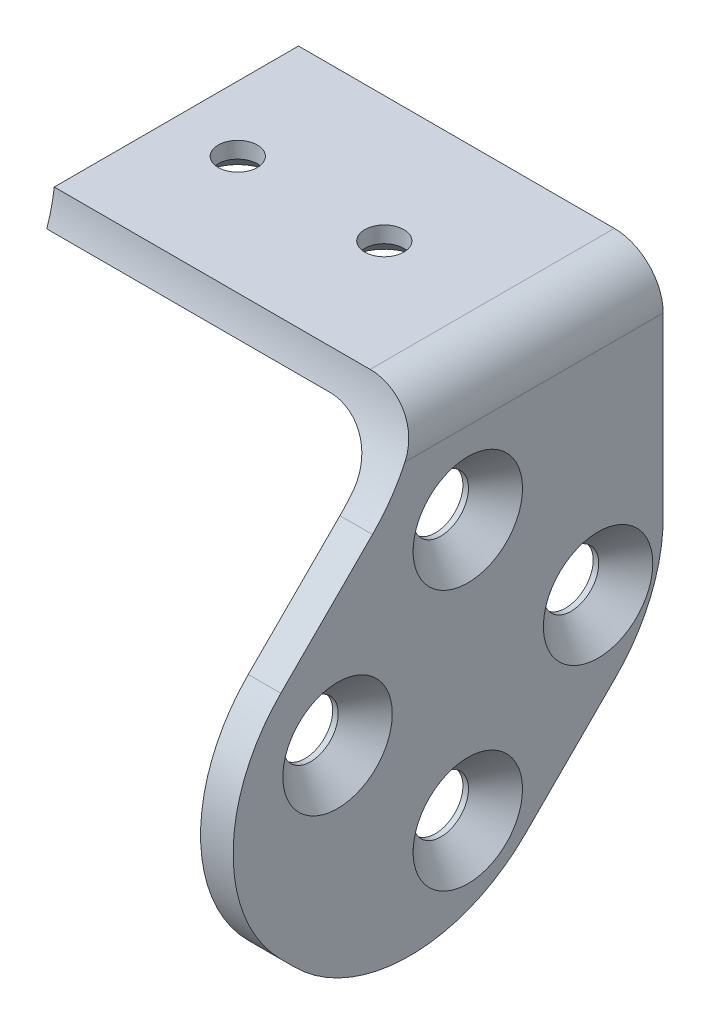
ISO-10303-21;
HEADER;
FILE_DESCRIPTION(('STEP AP214'),'2;1');
FILE_NAME('part.step','',(''),(''),'','','');
FILE_SCHEMA(('AUTOMOTIVE_DESIGN { 1 0 10303 214 1 1 1 1 }'));
ENDSEC;
DATA;
#1=APPLICATION_CONTEXT('core data for automotive mechanical design processes');
#2=APPLICATION_PROTOCOL_DEFINITION('international standard','automotive_design',2000,#1);
#3=PRODUCT_CONTEXT('',#1,'mechanical');
#4=PRODUCT('Part','Part','',(#3));
#5=PRODUCT_RELATED_PRODUCT_CATEGORY('part','',(#4));
#6=PRODUCT_DEFINITION_FORMATION('','',#4);
#7=PRODUCT_DEFINITION_CONTEXT('part definition',#1,'design');
#8=PRODUCT_DEFINITION('design','',#6,#7);
#9=PRODUCT_DEFINITION_SHAPE('','',#8);
#10=(LENGTH_UNIT() NAMED_UNIT(*) SI_UNIT(.MILLI.,.METRE.));
#11=(NAMED_UNIT(*) PLANE_ANGLE_UNIT() SI_UNIT($,.RADIAN.));
#12=(NAMED_UNIT(*) SI_UNIT($,.STERADIAN.) SOLID_ANGLE_UNIT());
#13=UNCERTAINTY_MEASURE_WITH_UNIT(LENGTH_MEASURE(1.E-05),#10,'distance_accuracy_value','');
#14=(GEOMETRIC_REPRESENTATION_CONTEXT(3) GLOBAL_UNCERTAINTY_ASSIGNED_CONTEXT((#13)) GLOBAL_UNIT_ASSIGNED_CONTEXT((#10,
#11,#12)) REPRESENTATION_CONTEXT('',''));
#15=CARTESIAN_POINT('',(0.,0.,0.));
#16=DIRECTION('',(0.,0.,1.));
#17=DIRECTION('',(1.,0.,0.));
#18=AXIS2_PLACEMENT_3D('',#15,#16,#17);
#19=CARTESIAN_POINT('',(0.,2.,0.));
#20=DIRECTION('',(1.,0.,0.));
#21=DIRECTION('',(0.,0.,-1.));
#22=AXIS2_PLACEMENT_3D('',#19,#20,#21);
#23=PLANE('',#22);
#24=DIRECTION('',(0.,0.,1.));
#25=VECTOR('',#24,1.);
#26=CARTESIAN_POINT('',(0.,0.,0.));
#27=LINE('',#26,#25);
#28=CARTESIAN_POINT('',(0.,0.,-15.));
#29=VERTEX_POINT('',#28);
#30=CARTESIAN_POINT('',(0.,0.,0.457120723979524));
#31=VERTEX_POINT('',#30);
#32=EDGE_CURVE('E145',#29,#31,#27,.T.);
#33=ORIENTED_EDGE('',*,*,#32,.T.);
#34=CARTESIAN_POINT('',(0.,3.21639176931118,9.92574385441978));
#35=DIRECTION('',(1.,0.,0.));
#36=DIRECTION('',(0.,0.,-1.));
#37=AXIS2_PLACEMENT_3D('',#34,#35,#36);
#38=CIRCLE('',#37,10.);
#39=CARTESIAN_POINT('',(0.,2.,0.));
#40=VERTEX_POINT('',#39);
#41=EDGE_CURVE('E140',#31,#40,#38,.T.);
#42=ORIENTED_EDGE('',*,*,#41,.T.);
#43=DIRECTION('',(0.,0.,1.));
#44=VECTOR('',#43,1.);
#45=CARTESIAN_POINT('',(0.,2.,0.));
#46=LINE('',#45,#44);
#47=CARTESIAN_POINT('',(0.,2.,-15.));
#48=VERTEX_POINT('',#47);
#49=EDGE_CURVE('E143',#48,#40,#46,.T.);
#50=ORIENTED_EDGE('',*,*,#49,.F.);
#51=DIRECTION('',(0.,-1.,0.));
#52=VECTOR('',#51,1.);
#53=CARTESIAN_POINT('',(0.,2.,-15.));
#54=LINE('',#53,#52);
#55=EDGE_CURVE('E166',#48,#29,#54,.T.);
#56=ORIENTED_EDGE('',*,*,#55,.T.);
#57=EDGE_LOOP('',(#33,#42,#50,#56));
#58=FACE_BOUND('',#57,.T.);
#59=ADVANCED_FACE('F39',(#58),#23,.F.);
#60=CARTESIAN_POINT('',(22.4,2.,0.));
#61=DIRECTION('',(-1.,0.,0.));
#62=DIRECTION('',(0.,0.,1.));
#63=AXIS2_PLACEMENT_3D('',#60,#61,#62);
#64=PLANE('',#63);
#65=CARTESIAN_POINT('',(22.4,-6.,-3.));
#66=DIRECTION('',(1.,0.,0.));
#67=DIRECTION('',(0.,0.,-1.));
#68=AXIS2_PLACEMENT_3D('',#65,#66,#67);
#69=CIRCLE('',#68,3.36);
#70=CARTESIAN_POINT('',(22.4,-6.,-6.36));
#71=VERTEX_POINT('',#70);
#72=EDGE_CURVE('E375',#71,#71,#69,.T.);
#73=ORIENTED_EDGE('',*,*,#72,.F.);
#74=EDGE_LOOP('',(#73));
#75=FACE_BOUND('',#74,.T.);
#76=CARTESIAN_POINT('',(22.4,-14.,-11.));
#77=DIRECTION('',(1.,0.,0.));
#78=DIRECTION('',(0.,0.,-1.));
#79=AXIS2_PLACEMENT_3D('',#76,#77,#78);
#80=CIRCLE('',#79,3.36);
#81=CARTESIAN_POINT('',(22.4,-14.,-14.36));
#82=VERTEX_POINT('',#81);
#83=EDGE_CURVE('E230',#82,#82,#80,.T.);
#84=ORIENTED_EDGE('',*,*,#83,.F.);
#85=EDGE_LOOP('',(#84));
#86=FACE_BOUND('',#85,.T.);
#87=CARTESIAN_POINT('',(22.4,-22.,-3.));
#88=DIRECTION('',(1.,0.,0.));
#89=DIRECTION('',(0.,0.,-1.));
#90=AXIS2_PLACEMENT_3D('',#87,#88,#89);
#91=CIRCLE('',#90,3.36);
#92=CARTESIAN_POINT('',(22.4,-22.,-6.36));
#93=VERTEX_POINT('',#92);
#94=EDGE_CURVE('E225',#93,#93,#91,.T.);
#95=ORIENTED_EDGE('',*,*,#94,.F.);
#96=EDGE_LOOP('',(#95));
#97=FACE_BOUND('',#96,.T.);
#98=CARTESIAN_POINT('',(22.4,-14.,5.));
#99=DIRECTION('',(1.,0.,0.));
#100=DIRECTION('',(0.,0.,-1.));
#101=AXIS2_PLACEMENT_3D('',#98,#99,#100);
#102=CIRCLE('',#101,3.36);
#103=CARTESIAN_POINT('',(22.4,-14.,1.64));
#104=VERTEX_POINT('',#103);
#105=EDGE_CURVE('E220',#104,#104,#102,.T.);
#106=ORIENTED_EDGE('',*,*,#105,.F.);
#107=EDGE_LOOP('',(#106));
#108=FACE_BOUND('',#107,.T.);
#109=DIRECTION('',(0.,-1.,0.));
#110=VECTOR('',#109,1.);
#111=CARTESIAN_POINT('',(22.4,2.,-15.));
#112=LINE('',#111,#110);
#113=CARTESIAN_POINT('',(22.4,-1.,-15.));
#114=VERTEX_POINT('',#113);
#115=CARTESIAN_POINT('',(22.4,-11.8578643762691,-15.));
#116=VERTEX_POINT('',#115);
#117=EDGE_CURVE('E174',#114,#116,#112,.T.);
#118=ORIENTED_EDGE('',*,*,#117,.F.);
#119=DIRECTION('',(0.,0.,-1.));
#120=VECTOR('',#119,1.);
#121=CARTESIAN_POINT('',(22.4,-1.,0.));
#122=LINE('',#121,#120);
#123=CARTESIAN_POINT('',(22.4,-1.,0.858106871849021));
#124=VERTEX_POINT('',#123);
#125=EDGE_CURVE('E235',#114,#124,#122,.F.);
#126=ORIENTED_EDGE('',*,*,#125,.T.);
#127=CARTESIAN_POINT('',(22.4,3.21639176931118,9.92574385441978));
#128=DIRECTION('',(-1.,0.,0.));
#129=DIRECTION('',(0.,0.,1.));
#130=AXIS2_PLACEMENT_3D('',#127,#128,#129);
#131=CIRCLE('',#130,10.);
#132=CARTESIAN_POINT('',(22.4,-3.8546760425543,2.85467604255431));
#133=VERTEX_POINT('',#132);
#134=EDGE_CURVE('E147',#124,#133,#131,.T.);
#135=ORIENTED_EDGE('',*,*,#134,.T.);
#136=DIRECTION('',(0.,0.707106781186546,-0.707106781186549));
#137=VECTOR('',#136,1.);
#138=CARTESIAN_POINT('',(22.4,-16.556349186104,15.5563491861041));
#139=LINE('',#138,#137);
#140=CARTESIAN_POINT('',(22.4,-9.48528137423855,8.48528137423858));
#141=VERTEX_POINT('',#140);
#142=EDGE_CURVE('E400',#141,#133,#139,.T.);
#143=ORIENTED_EDGE('',*,*,#142,.F.);
#144=CARTESIAN_POINT('',(22.4,-16.556349186104,1.41421356237312));
#145=DIRECTION('',(-1.,0.,0.));
#146=DIRECTION('',(0.,0.,1.));
#147=AXIS2_PLACEMENT_3D('',#144,#145,#146);
#148=CIRCLE('',#147,10.);
#149=CARTESIAN_POINT('',(22.4,-23.6274169979695,8.48528137423861));
#150=VERTEX_POINT('',#149);
#151=EDGE_CURVE('E198',#141,#150,#148,.F.);
#152=ORIENTED_EDGE('',*,*,#151,.T.);
#153=DIRECTION('',(0.,0.707106781186549,0.707106781186546));
#154=VECTOR('',#153,1.);
#155=CARTESIAN_POINT('',(22.4,-16.556349186104,15.5563491861041));
#156=LINE('',#155,#154);
#157=CARTESIAN_POINT('',(22.4,-24.4852813742386,7.62741699796954));
#158=VERTEX_POINT('',#157);
#159=EDGE_CURVE('E394',#158,#150,#156,.T.);
#160=ORIENTED_EDGE('',*,*,#159,.F.);
#161=CARTESIAN_POINT('',(22.4,-17.4142135623731,0.55634918610405));
#162=DIRECTION('',(-1.,0.,0.));
#163=DIRECTION('',(0.,0.,1.));
#164=AXIS2_PLACEMENT_3D('',#161,#162,#163);
#165=CIRCLE('',#164,10.);
#166=CARTESIAN_POINT('',(22.4,-24.4852813742386,-6.51471862576141));
#167=VERTEX_POINT('',#166);
#168=EDGE_CURVE('E196',#158,#167,#165,.F.);
#169=ORIENTED_EDGE('',*,*,#168,.T.);
#170=DIRECTION('',(0.,0.707106781186546,-0.707106781186549));
#171=VECTOR('',#170,1.);
#172=CARTESIAN_POINT('',(22.4,-31.5563491861041,0.556349186104078));
#173=LINE('',#172,#171);
#174=CARTESIAN_POINT('',(22.4,-18.9289321881346,-12.0710678118655));
#175=VERTEX_POINT('',#174);
#176=EDGE_CURVE('E403',#167,#175,#173,.T.);
#177=ORIENTED_EDGE('',*,*,#176,.T.);
#178=CARTESIAN_POINT('',(22.4,-11.8578643762691,-5.));
#179=DIRECTION('',(-1.,0.,0.));
#180=DIRECTION('',(0.,0.,1.));
#181=AXIS2_PLACEMENT_3D('',#178,#179,#180);
#182=CIRCLE('',#181,10.);
#183=EDGE_CURVE('E193',#175,#116,#182,.F.);
#184=ORIENTED_EDGE('',*,*,#183,.T.);
#185=EDGE_LOOP('',(#118,#126,#135,#143,#152,#160,#169,#177,#184));
#186=FACE_BOUND('',#185,.T.);
#187=ADVANCED_FACE('F273',(#75,#86,#97,#108,#186),#64,.F.);
#188=CARTESIAN_POINT('',(0.,2.,-15.));
#189=DIRECTION('',(0.,0.,1.));
#190=DIRECTION('',(1.,0.,0.));
#191=AXIS2_PLACEMENT_3D('',#188,#189,#190);
#192=PLANE('',#191);
#193=DIRECTION('',(-1.,0.,0.));
#194=VECTOR('',#193,1.);
#195=CARTESIAN_POINT('',(0.,2.,-15.));
#196=LINE('',#195,#194);
#197=CARTESIAN_POINT('',(19.4,2.,-15.));
#198=VERTEX_POINT('',#197);
#199=EDGE_CURVE('E157',#198,#48,#196,.T.);
#200=ORIENTED_EDGE('',*,*,#199,.F.);
#201=CARTESIAN_POINT('',(19.4,-1.,-15.));
#202=DIRECTION('',(0.,0.,1.));
#203=DIRECTION('',(1.,0.,0.));
#204=AXIS2_PLACEMENT_3D('',#201,#202,#203);
#205=CIRCLE('',#204,3.);
#206=EDGE_CURVE('E233',#198,#114,#205,.F.);
#207=ORIENTED_EDGE('',*,*,#206,.T.);
#208=ORIENTED_EDGE('',*,*,#117,.T.);
#209=DIRECTION('',(1.,0.,0.));
#210=VECTOR('',#209,1.);
#211=CARTESIAN_POINT('',(0.,-11.8578643762691,-15.));
#212=LINE('',#211,#210);
#213=CARTESIAN_POINT('',(20.4,-11.8578643762691,-15.));
#214=VERTEX_POINT('',#213);
#215=EDGE_CURVE('E205',#116,#214,#212,.F.);
#216=ORIENTED_EDGE('',*,*,#215,.T.);
#217=DIRECTION('',(0.,1.,0.));
#218=VECTOR('',#217,1.);
#219=CARTESIAN_POINT('',(20.4,-1.,-15.));
#220=LINE('',#219,#218);
#221=CARTESIAN_POINT('',(20.4,-3.,-15.));
#222=VERTEX_POINT('',#221);
#223=EDGE_CURVE('E171',#214,#222,#220,.T.);
#224=ORIENTED_EDGE('',*,*,#223,.T.);
#225=CARTESIAN_POINT('',(17.4,-3.,-15.));
#226=DIRECTION('',(0.,0.,1.));
#227=DIRECTION('',(1.,0.,0.));
#228=AXIS2_PLACEMENT_3D('',#225,#226,#227);
#229=CIRCLE('',#228,3.);
#230=CARTESIAN_POINT('',(17.4,0.,-15.));
#231=VERTEX_POINT('',#230);
#232=EDGE_CURVE('E53',#222,#231,#229,.T.);
#233=ORIENTED_EDGE('',*,*,#232,.T.);
#234=DIRECTION('',(-1.,0.,0.));
#235=VECTOR('',#234,1.);
#236=CARTESIAN_POINT('',(0.,0.,-15.));
#237=LINE('',#236,#235);
#238=EDGE_CURVE('E159',#231,#29,#237,.T.);
#239=ORIENTED_EDGE('',*,*,#238,.T.);
#240=ORIENTED_EDGE('',*,*,#55,.F.);
#241=EDGE_LOOP('',(#200,#207,#208,#216,#224,#233,#239,#240));
#242=FACE_BOUND('',#241,.T.);
#243=ADVANCED_FACE('F277',(#242),#192,.F.);
#244=CARTESIAN_POINT('',(0.,2.,0.));
#245=DIRECTION('',(0.,-1.,0.));
#246=DIRECTION('',(0.,0.,-1.));
#247=AXIS2_PLACEMENT_3D('',#244,#245,#246);
#248=PLANE('',#247);
#249=CARTESIAN_POINT('',(13.,2.,-7.27143963801024));
#250=DIRECTION('',(0.,-1.,0.));
#251=DIRECTION('',(0.,0.,-1.));
#252=AXIS2_PLACEMENT_3D('',#249,#250,#251);
#253=CIRCLE('',#252,1.2);
#254=CARTESIAN_POINT('',(13.,2.,-8.47143963801024));
#255=VERTEX_POINT('',#254);
#256=EDGE_CURVE('E361',#255,#255,#253,.T.);
#257=ORIENTED_EDGE('',*,*,#256,.T.);
#258=EDGE_LOOP('',(#257));
#259=FACE_BOUND('',#258,.T.);
#260=CARTESIAN_POINT('',(4.,2.,-7.27143963801024));
#261=DIRECTION('',(0.,-1.,0.));
#262=DIRECTION('',(0.,0.,-1.));
#263=AXIS2_PLACEMENT_3D('',#260,#261,#262);
#264=CIRCLE('',#263,1.2);
#265=CARTESIAN_POINT('',(4.,2.,-8.47143963801024));
#266=VERTEX_POINT('',#265);
#267=EDGE_CURVE('E372',#266,#266,#264,.T.);
#268=ORIENTED_EDGE('',*,*,#267,.T.);
#269=EDGE_LOOP('',(#268));
#270=FACE_BOUND('',#269,.T.);
#271=DIRECTION('',(1.,0.,0.));
#272=VECTOR('',#271,1.);
#273=CARTESIAN_POINT('',(0.,2.,0.));
#274=LINE('',#273,#272);
#275=CARTESIAN_POINT('',(19.4,2.,0.));
#276=VERTEX_POINT('',#275);
#277=EDGE_CURVE('E154',#40,#276,#274,.T.);
#278=ORIENTED_EDGE('',*,*,#277,.T.);
#279=DIRECTION('',(0.,0.,-1.));
#280=VECTOR('',#279,1.);
#281=CARTESIAN_POINT('',(19.4,2.,0.));
#282=LINE('',#281,#280);
#283=EDGE_CURVE('E211',#276,#198,#282,.T.);
#284=ORIENTED_EDGE('',*,*,#283,.T.);
#285=ORIENTED_EDGE('',*,*,#199,.T.);
#286=ORIENTED_EDGE('',*,*,#49,.T.);
#287=EDGE_LOOP('',(#278,#284,#285,#286));
#288=FACE_BOUND('',#287,.T.);
#289=ADVANCED_FACE('F152',(#259,#270,#288),#248,.F.);
#290=CARTESIAN_POINT('',(0.,0.,0.));
#291=DIRECTION('',(0.,-1.,0.));
#292=DIRECTION('',(0.,0.,-1.));
#293=AXIS2_PLACEMENT_3D('',#290,#291,#292);
#294=PLANE('',#293);
#295=CARTESIAN_POINT('',(13.,0.,-7.27143963801024));
#296=DIRECTION('',(0.,-1.,0.));
#297=DIRECTION('',(0.,0.,-1.));
#298=AXIS2_PLACEMENT_3D('',#295,#296,#297);
#299=CIRCLE('',#298,2.2);
#300=CARTESIAN_POINT('',(13.,0.,-9.47143963801024));
#301=VERTEX_POINT('',#300);
#302=EDGE_CURVE('E359',#301,#301,#299,.T.);
#303=ORIENTED_EDGE('',*,*,#302,.F.);
#304=EDGE_LOOP('',(#303));
#305=FACE_BOUND('',#304,.T.);
#306=CARTESIAN_POINT('',(4.,0.,-7.27143963801024));
#307=DIRECTION('',(0.,-1.,0.));
#308=DIRECTION('',(0.,0.,-1.));
#309=AXIS2_PLACEMENT_3D('',#306,#307,#308);
#310=CIRCLE('',#309,2.2);
#311=CARTESIAN_POINT('',(4.,0.,-9.47143963801024));
#312=VERTEX_POINT('',#311);
#313=EDGE_CURVE('E366',#312,#312,#310,.T.);
#314=ORIENTED_EDGE('',*,*,#313,.F.);
#315=EDGE_LOOP('',(#314));
#316=FACE_BOUND('',#315,.T.);
#317=ORIENTED_EDGE('',*,*,#238,.F.);
#318=DIRECTION('',(0.,0.,-1.));
#319=VECTOR('',#318,1.);
#320=CARTESIAN_POINT('',(17.4,0.,0.));
#321=LINE('',#320,#319);
#322=CARTESIAN_POINT('',(17.4,0.,0.457120723979524));
#323=VERTEX_POINT('',#322);
#324=EDGE_CURVE('E66',#231,#323,#321,.F.);
#325=ORIENTED_EDGE('',*,*,#324,.T.);
#326=DIRECTION('',(-1.,0.,0.));
#327=VECTOR('',#326,1.);
#328=CARTESIAN_POINT('',(20.4,0.,0.457120723979524));
#329=LINE('',#328,#327);
#330=EDGE_CURVE('E148',#323,#31,#329,.T.);
#331=ORIENTED_EDGE('',*,*,#330,.T.);
#332=ORIENTED_EDGE('',*,*,#32,.F.);
#333=EDGE_LOOP('',(#317,#325,#331,#332));
#334=FACE_BOUND('',#333,.T.);
#335=ADVANCED_FACE('F287',(#305,#316,#334),#294,.T.);
#336=CARTESIAN_POINT('',(20.4,-1.,0.));
#337=DIRECTION('',(1.,0.,0.));
#338=DIRECTION('',(0.,0.,-1.));
#339=AXIS2_PLACEMENT_3D('',#336,#337,#338);
#340=PLANE('',#339);
#341=CARTESIAN_POINT('',(20.4,-6.,-3.));
#342=DIRECTION('',(1.,0.,0.));
#343=DIRECTION('',(0.,0.,-1.));
#344=AXIS2_PLACEMENT_3D('',#341,#342,#343);
#345=CIRCLE('',#344,1.69999999999999);
#346=CARTESIAN_POINT('',(20.4,-6.,-4.69999999999999));
#347=VERTEX_POINT('',#346);
#348=EDGE_CURVE('E227',#347,#347,#345,.T.);
#349=ORIENTED_EDGE('',*,*,#348,.T.);
#350=EDGE_LOOP('',(#349));
#351=FACE_BOUND('',#350,.T.);
#352=CARTESIAN_POINT('',(20.4,-14.,-11.));
#353=DIRECTION('',(1.,0.,0.));
#354=DIRECTION('',(0.,0.,-1.));
#355=AXIS2_PLACEMENT_3D('',#352,#353,#354);
#356=CIRCLE('',#355,1.69999999999999);
#357=CARTESIAN_POINT('',(20.4,-14.,-12.7));
#358=VERTEX_POINT('',#357);
#359=EDGE_CURVE('E222',#358,#358,#356,.T.);
#360=ORIENTED_EDGE('',*,*,#359,.T.);
#361=EDGE_LOOP('',(#360));
#362=FACE_BOUND('',#361,.T.);
#363=CARTESIAN_POINT('',(20.4,-22.,-3.));
#364=DIRECTION('',(1.,0.,0.));
#365=DIRECTION('',(0.,0.,-1.));
#366=AXIS2_PLACEMENT_3D('',#363,#364,#365);
#367=CIRCLE('',#366,1.69999999999999);
#368=CARTESIAN_POINT('',(20.4,-22.,-4.7));
#369=VERTEX_POINT('',#368);
#370=EDGE_CURVE('E217',#369,#369,#367,.T.);
#371=ORIENTED_EDGE('',*,*,#370,.T.);
#372=EDGE_LOOP('',(#371));
#373=FACE_BOUND('',#372,.T.);
#374=CARTESIAN_POINT('',(20.4,-14.,5.));
#375=DIRECTION('',(1.,0.,0.));
#376=DIRECTION('',(0.,0.,-1.));
#377=AXIS2_PLACEMENT_3D('',#374,#375,#376);
#378=CIRCLE('',#377,1.69999999999999);
#379=CARTESIAN_POINT('',(20.4,-14.,3.3));
#380=VERTEX_POINT('',#379);
#381=EDGE_CURVE('E212',#380,#380,#378,.T.);
#382=ORIENTED_EDGE('',*,*,#381,.T.);
#383=EDGE_LOOP('',(#382));
#384=FACE_BOUND('',#383,.T.);
#385=CARTESIAN_POINT('',(20.4,3.21639176931118,9.92574385441978));
#386=DIRECTION('',(1.,0.,0.));
#387=DIRECTION('',(0.,0.,-1.));
#388=AXIS2_PLACEMENT_3D('',#385,#386,#387);
#389=CIRCLE('',#388,10.);
#390=CARTESIAN_POINT('',(20.4,-3.8546760425543,2.85467604255431));
#391=VERTEX_POINT('',#390);
#392=CARTESIAN_POINT('',(20.4,-3.,2.09270655268042));
#393=VERTEX_POINT('',#392);
#394=EDGE_CURVE('E207',#391,#393,#389,.T.);
#395=ORIENTED_EDGE('',*,*,#394,.T.);
#396=DIRECTION('',(0.,0.,-1.));
#397=VECTOR('',#396,1.);
#398=CARTESIAN_POINT('',(20.4,-3.,0.));
#399=LINE('',#398,#397);
#400=EDGE_CURVE('E242',#393,#222,#399,.T.);
#401=ORIENTED_EDGE('',*,*,#400,.T.);
#402=ORIENTED_EDGE('',*,*,#223,.F.);
#403=CARTESIAN_POINT('',(20.4,-11.8578643762691,-5.));
#404=DIRECTION('',(1.,0.,0.));
#405=DIRECTION('',(0.,0.,-1.));
#406=AXIS2_PLACEMENT_3D('',#403,#404,#405);
#407=CIRCLE('',#406,10.);
#408=CARTESIAN_POINT('',(20.4,-18.9289321881346,-12.0710678118655));
#409=VERTEX_POINT('',#408);
#410=EDGE_CURVE('E187',#214,#409,#407,.F.);
#411=ORIENTED_EDGE('',*,*,#410,.T.);
#412=DIRECTION('',(0.,0.707106781186546,-0.707106781186549));
#413=VECTOR('',#412,1.);
#414=CARTESIAN_POINT('',(20.4,-31.5563491861041,0.556349186104078));
#415=LINE('',#414,#413);
#416=CARTESIAN_POINT('',(20.4,-24.4852813742386,-6.51471862576141));
#417=VERTEX_POINT('',#416);
#418=EDGE_CURVE('E406',#417,#409,#415,.T.);
#419=ORIENTED_EDGE('',*,*,#418,.F.);
#420=CARTESIAN_POINT('',(20.4,-17.4142135623731,0.55634918610405));
#421=DIRECTION('',(1.,0.,0.));
#422=DIRECTION('',(0.,0.,-1.));
#423=AXIS2_PLACEMENT_3D('',#420,#421,#422);
#424=CIRCLE('',#423,10.);
#425=CARTESIAN_POINT('',(20.4,-24.4852813742386,7.62741699796954));
#426=VERTEX_POINT('',#425);
#427=EDGE_CURVE('E189',#417,#426,#424,.F.);
#428=ORIENTED_EDGE('',*,*,#427,.T.);
#429=DIRECTION('',(0.,-0.707106781186549,-0.707106781186546));
#430=VECTOR('',#429,1.);
#431=CARTESIAN_POINT('',(20.4,-16.556349186104,15.5563491861041));
#432=LINE('',#431,#430);
#433=CARTESIAN_POINT('',(20.4,-23.6274169979695,8.48528137423861));
#434=VERTEX_POINT('',#433);
#435=EDGE_CURVE('E215',#434,#426,#432,.T.);
#436=ORIENTED_EDGE('',*,*,#435,.F.);
#437=CARTESIAN_POINT('',(20.4,-16.556349186104,1.41421356237312));
#438=DIRECTION('',(1.,0.,0.));
#439=DIRECTION('',(0.,0.,-1.));
#440=AXIS2_PLACEMENT_3D('',#437,#438,#439);
#441=CIRCLE('',#440,10.);
#442=CARTESIAN_POINT('',(20.4,-9.48528137423855,8.48528137423858));
#443=VERTEX_POINT('',#442);
#444=EDGE_CURVE('E191',#434,#443,#441,.F.);
#445=ORIENTED_EDGE('',*,*,#444,.T.);
#446=DIRECTION('',(0.,0.707106781186546,-0.707106781186549));
#447=VECTOR('',#446,1.);
#448=CARTESIAN_POINT('',(20.4,-16.556349186104,15.5563491861041));
#449=LINE('',#448,#447);
#450=EDGE_CURVE('E397',#443,#391,#449,.T.);
#451=ORIENTED_EDGE('',*,*,#450,.T.);
#452=EDGE_LOOP('',(#395,#401,#402,#411,#419,#428,#436,#445,#451));
#453=FACE_BOUND('',#452,.T.);
#454=ADVANCED_FACE('F290',(#351,#362,#373,#384,#453),#340,.F.);
#455=CARTESIAN_POINT('',(20.4,-31.5563491861041,0.556349186104078));
#456=DIRECTION('',(0.,0.707106781186549,0.707106781186546));
#457=DIRECTION('',(0.,-0.707106781186546,0.707106781186549));
#458=AXIS2_PLACEMENT_3D('',#455,#456,#457);
#459=PLANE('',#458);
#460=ORIENTED_EDGE('',*,*,#176,.F.);
#461=DIRECTION('',(1.,0.,0.));
#462=VECTOR('',#461,1.);
#463=CARTESIAN_POINT('',(20.4,-24.4852813742386,-6.51471862576141));
#464=LINE('',#463,#462);
#465=EDGE_CURVE('E203',#167,#417,#464,.F.);
#466=ORIENTED_EDGE('',*,*,#465,.T.);
#467=ORIENTED_EDGE('',*,*,#418,.T.);
#468=DIRECTION('',(1.,0.,0.));
#469=VECTOR('',#468,1.);
#470=CARTESIAN_POINT('',(20.4,-18.9289321881346,-12.0710678118655));
#471=LINE('',#470,#469);
#472=EDGE_CURVE('E200',#409,#175,#471,.T.);
#473=ORIENTED_EDGE('',*,*,#472,.T.);
#474=EDGE_LOOP('',(#460,#466,#467,#473));
#475=FACE_BOUND('',#474,.T.);
#476=ADVANCED_FACE('F297',(#475),#459,.F.);
#477=CARTESIAN_POINT('',(20.4,-16.556349186104,15.5563491861041));
#478=DIRECTION('',(0.,-0.707106781186549,-0.707106781186546));
#479=DIRECTION('',(0.,0.707106781186546,-0.707106781186549));
#480=AXIS2_PLACEMENT_3D('',#477,#478,#479);
#481=PLANE('',#480);
#482=ORIENTED_EDGE('',*,*,#142,.T.);
#483=DIRECTION('',(-1.,0.,0.));
#484=VECTOR('',#483,1.);
#485=CARTESIAN_POINT('',(20.4,-3.8546760425543,2.85467604255431));
#486=LINE('',#485,#484);
#487=EDGE_CURVE('E178',#133,#391,#486,.T.);
#488=ORIENTED_EDGE('',*,*,#487,.T.);
#489=ORIENTED_EDGE('',*,*,#450,.F.);
#490=DIRECTION('',(-1.,0.,0.));
#491=VECTOR('',#490,1.);
#492=CARTESIAN_POINT('',(22.4,-9.48528137423855,8.48528137423858));
#493=LINE('',#492,#491);
#494=EDGE_CURVE('E176',#443,#141,#493,.F.);
#495=ORIENTED_EDGE('',*,*,#494,.T.);
#496=EDGE_LOOP('',(#482,#488,#489,#495));
#497=FACE_BOUND('',#496,.T.);
#498=ADVANCED_FACE('F301',(#497),#481,.F.);
#499=CARTESIAN_POINT('',(0.,-16.056349186104,16.0563491861041));
#500=DIRECTION('',(0.,-0.707106781186546,0.707106781186549));
#501=DIRECTION('',(0.,-0.707106781186549,-0.707106781186546));
#502=AXIS2_PLACEMENT_3D('',#499,#500,#501);
#503=PLANE('',#502);
#504=ORIENTED_EDGE('',*,*,#159,.T.);
#505=DIRECTION('',(-1.,0.,0.));
#506=VECTOR('',#505,1.);
#507=CARTESIAN_POINT('',(20.4,-23.6274169979695,8.48528137423861));
#508=LINE('',#507,#506);
#509=EDGE_CURVE('E184',#150,#434,#508,.T.);
#510=ORIENTED_EDGE('',*,*,#509,.T.);
#511=ORIENTED_EDGE('',*,*,#435,.T.);
#512=DIRECTION('',(1.,0.,0.));
#513=VECTOR('',#512,1.);
#514=CARTESIAN_POINT('',(22.4,-24.4852813742386,7.62741699796954));
#515=LINE('',#514,#513);
#516=EDGE_CURVE('E181',#426,#158,#515,.T.);
#517=ORIENTED_EDGE('',*,*,#516,.T.);
#518=EDGE_LOOP('',(#504,#510,#511,#517));
#519=FACE_BOUND('',#518,.T.);
#520=ADVANCED_FACE('F252',(#519),#503,.T.);
#521=CARTESIAN_POINT('',(0.,3.21639176931118,9.92574385441978));
#522=DIRECTION('',(-1.,0.,0.));
#523=DIRECTION('',(0.,0.,1.));
#524=AXIS2_PLACEMENT_3D('',#521,#522,#523);
#525=CYLINDRICAL_SURFACE('',#524,10.);
#526=ORIENTED_EDGE('',*,*,#134,.F.);
#527=CARTESIAN_POINT('',(22.4,-1.,0.858106871849021));
#528=CARTESIAN_POINT('',(22.400006808661,-0.919493682935719,0.82066094416926));
#529=CARTESIAN_POINT('',(22.3967587630625,-0.838466817579276,0.784298954807176));
#530=CARTESIAN_POINT('',(22.3835559289947,-0.675903507410331,0.713912604469764));
#531=CARTESIAN_POINT('',(22.3735980221706,-0.594366843136106,0.679889338503157));
#532=CARTESIAN_POINT('',(22.3467541266625,-0.431245942520502,0.61432690290318));
#533=CARTESIAN_POINT('',(22.3298558035476,-0.349661881040638,0.582792275610965));
#534=CARTESIAN_POINT('',(22.2890365449334,-0.187296139717696,0.522423734854869));
#535=CARTESIAN_POINT('',(22.2651167546412,-0.10651433124603,0.493589381984779));
#536=CARTESIAN_POINT('',(22.1825314284687,0.13412994642927,0.411106819727787));
#537=CARTESIAN_POINT('',(22.1131003689926,0.291912050338287,0.361630087695078));
#538=CARTESIAN_POINT('',(21.9465906360191,0.595240616041925,0.27408342404882));
#539=CARTESIAN_POINT('',(21.8495516296278,0.740804247517243,0.235997286320188));
#540=CARTESIAN_POINT('',(21.636491004607,1.00634191018833,0.172114624312908));
#541=CARTESIAN_POINT('',(21.5218717716492,1.12730313337135,0.14573998744576));
#542=CARTESIAN_POINT('',(21.27322950271,1.34920955057763,0.100954405464787));
#543=CARTESIAN_POINT('',(21.1391982857954,1.45014626281139,0.0825468310782676));
#544=CARTESIAN_POINT('',(20.8581680851646,1.62694504737411,0.0524672822620723));
#545=CARTESIAN_POINT('',(20.7114365873178,1.70321440740472,0.0406832436795716));
#546=CARTESIAN_POINT('',(20.4072129322287,1.8306688977748,0.0220102266430368));
#547=CARTESIAN_POINT('',(20.2497266543387,1.88186761045189,0.0151185967529871));
#548=CARTESIAN_POINT('',(19.9762827383931,1.9464155989033,0.0066767561333513));
#549=CARTESIAN_POINT('',(19.8618934884087,1.96649149507983,0.00414779178820919));
#550=CARTESIAN_POINT('',(19.6316839747455,1.99328620651592,0.000822779843010123));
#551=CARTESIAN_POINT('',(19.5158657136452,2.00002195824216,2.45348229177904E-05));
#552=CARTESIAN_POINT('',(19.4,2.,0.));
#553=B_SPLINE_CURVE_WITH_KNOTS('',3,(#527,#528,#529,#530,#531,#532,#533,#534,#535,#536,#537,
#538,#539,#540,#541,#542,#543,#544,#545,#546,#547,#548,#549,#550,#551,#552),.UNSPECIFIED.,.F.,
.F.,(4,2,2,2,2,2,2,2,2,2,2,2,4),(0.,0.26631967882322,0.532763213047048,0.799682330922458,
1.06655793823376,1.60153064498657,2.13573855135867,2.6394060301128,3.14328639411909,
3.63836303938686,4.13317117310763,4.48091969712875,4.8282264405913),.UNSPECIFIED.);
#554=EDGE_CURVE('E164',#124,#276,#553,.T.);
#555=ORIENTED_EDGE('',*,*,#554,.T.);
#556=ORIENTED_EDGE('',*,*,#277,.F.);
#557=ORIENTED_EDGE('',*,*,#41,.F.);
#558=ORIENTED_EDGE('',*,*,#330,.F.);
#559=CARTESIAN_POINT('',(17.4,0.,0.457120723979524));
#560=CARTESIAN_POINT('',(17.4801428785397,9.90825038176579E-06,0.457124985497131));
#561=CARTESIAN_POINT('',(17.5602820338007,-0.0032113305937593,0.458211779545173));
#562=CARTESIAN_POINT('',(17.7199824956677,-0.0160407242411635,0.462580307827671));
#563=CARTESIAN_POINT('',(17.7995438372024,-0.0256484896755368,0.465861908250917));
#564=CARTESIAN_POINT('',(17.9574292312288,-0.0511595874567448,0.474644413585374));
#565=CARTESIAN_POINT('',(18.0357547087411,-0.0670550187516999,0.480142533394017));
#566=CARTESIAN_POINT('',(18.1906885006994,-0.104972797890192,0.493409192825309));
#567=CARTESIAN_POINT('',(18.2672968358106,-0.126995071957216,0.501177705109032));
#568=CARTESIAN_POINT('',(18.4938019234549,-0.201995667995781,0.528005199199882));
#569=CARTESIAN_POINT('',(18.6404485656007,-0.263919187726411,0.550589844254001));
#570=CARTESIAN_POINT('',(18.9205843179693,-0.409102549654276,0.605777341144624));
#571=CARTESIAN_POINT('',(19.0540743528157,-0.492360890994638,0.638379488304417));
#572=CARTESIAN_POINT('',(19.3052445148099,-0.677395871415667,0.71442229653399));
#573=CARTESIAN_POINT('',(19.4228347243953,-0.779270746547882,0.757920930748149));
#574=CARTESIAN_POINT('',(19.6386894526576,-0.997056481662923,0.855954531549253));
#575=CARTESIAN_POINT('',(19.736959869316,-1.11296304051431,0.910486119628408));
#576=CARTESIAN_POINT('',(19.9159283076233,-1.35865133394876,1.03257565671428));
#577=CARTESIAN_POINT('',(19.9958781217776,-1.48877969065002,1.10052752023588));
#578=CARTESIAN_POINT('',(20.1334748995374,-1.75477395752239,1.24757484169476));
#579=CARTESIAN_POINT('',(20.1910764755642,-1.89065092878554,1.32669253703043));
#580=CARTESIAN_POINT('',(20.2660325497774,-2.10925485315616,1.46129691840555));
#581=CARTESIAN_POINT('',(20.290283429001,-2.19163534149928,1.51367284460885));
#582=CARTESIAN_POINT('',(20.3313201415396,-2.3561484680209,1.62174054332424));
#583=CARTESIAN_POINT('',(20.3481026535924,-2.43828097982796,1.67743377862074));
#584=CARTESIAN_POINT('',(20.3745264346158,-2.60126873553245,1.79157640371626));
#585=CARTESIAN_POINT('',(20.3841950772701,-2.6821276913067,1.8500142983479));
#586=CARTESIAN_POINT('',(20.3969288547956,-2.84231313027939,1.96948084880323));
#587=CARTESIAN_POINT('',(20.4000009052061,-2.92164113187775,2.0305067229847));
#588=CARTESIAN_POINT('',(20.4,-3.,2.09270655268042));
#589=B_SPLINE_CURVE_WITH_KNOTS('',3,(#559,#560,#561,#562,#563,#564,#565,#566,#567,#568,#569,
#570,#571,#572,#573,#574,#575,#576,#577,#578,#579,#580,#581,#582,#583,#584,#585,#586,#587,#588),
.UNSPECIFIED.,.F.,.F.,(4,2,2,2,2,2,2,2,2,2,2,2,2,2,4),(0.,0.240349882146301,0.480685112167836,
0.720719292571344,0.960750582723001,1.44060335002612,1.92042237002552,2.40285052738069,
2.88513117871681,3.38454344343188,3.88496473267222,4.1864303886662,4.48802997598823,
4.78846287090683,5.08858065284013),.UNSPECIFIED.);
#590=EDGE_CURVE('E11',#323,#393,#589,.T.);
#591=ORIENTED_EDGE('',*,*,#590,.T.);
#592=ORIENTED_EDGE('',*,*,#394,.F.);
#593=ORIENTED_EDGE('',*,*,#487,.F.);
#594=EDGE_LOOP('',(#526,#555,#556,#557,#558,#591,#592,#593));
#595=FACE_BOUND('',#594,.T.);
#596=ADVANCED_FACE('F162',(#595),#525,.F.);
#597=CARTESIAN_POINT('',(0.,-16.556349186104,1.41421356237312));
#598=DIRECTION('',(1.,0.,0.));
#599=DIRECTION('',(0.,0.,-1.));
#600=AXIS2_PLACEMENT_3D('',#597,#598,#599);
#601=CYLINDRICAL_SURFACE('',#600,10.);
#602=ORIENTED_EDGE('',*,*,#151,.F.);
#603=ORIENTED_EDGE('',*,*,#494,.F.);
#604=ORIENTED_EDGE('',*,*,#444,.F.);
#605=ORIENTED_EDGE('',*,*,#509,.F.);
#606=EDGE_LOOP('',(#602,#603,#604,#605));
#607=FACE_BOUND('',#606,.T.);
#608=ADVANCED_FACE('F251',(#607),#601,.T.);
#609=CARTESIAN_POINT('',(0.,-17.4142135623731,0.55634918610405));
#610=DIRECTION('',(-1.,0.,0.));
#611=DIRECTION('',(0.,0.,1.));
#612=AXIS2_PLACEMENT_3D('',#609,#610,#611);
#613=CYLINDRICAL_SURFACE('',#612,10.);
#614=ORIENTED_EDGE('',*,*,#427,.F.);
#615=ORIENTED_EDGE('',*,*,#465,.F.);
#616=ORIENTED_EDGE('',*,*,#168,.F.);
#617=ORIENTED_EDGE('',*,*,#516,.F.);
#618=EDGE_LOOP('',(#614,#615,#616,#617));
#619=FACE_BOUND('',#618,.T.);
#620=ADVANCED_FACE('F257',(#619),#613,.T.);
#621=CARTESIAN_POINT('',(20.4,-11.8578643762691,-5.));
#622=DIRECTION('',(1.,0.,0.));
#623=DIRECTION('',(0.,0.,-1.));
#624=AXIS2_PLACEMENT_3D('',#621,#622,#623);
#625=CYLINDRICAL_SURFACE('',#624,10.);
#626=ORIENTED_EDGE('',*,*,#410,.F.);
#627=ORIENTED_EDGE('',*,*,#215,.F.);
#628=ORIENTED_EDGE('',*,*,#183,.F.);
#629=ORIENTED_EDGE('',*,*,#472,.F.);
#630=EDGE_LOOP('',(#626,#627,#628,#629));
#631=FACE_BOUND('',#630,.T.);
#632=ADVANCED_FACE('F260',(#631),#625,.T.);
#633=CARTESIAN_POINT('',(22.4,-14.,5.));
#634=DIRECTION('',(1.,0.,0.));
#635=DIRECTION('',(0.,0.,-1.));
#636=AXIS2_PLACEMENT_3D('',#633,#634,#635);
#637=CYLINDRICAL_SURFACE('',#636,1.69999999999999);
#638=CARTESIAN_POINT('',(20.74,-14.,5.));
#639=DIRECTION('',(1.,0.,0.));
#640=DIRECTION('',(0.,0.,-1.));
#641=AXIS2_PLACEMENT_3D('',#638,#639,#640);
#642=CIRCLE('',#641,1.7);
#643=CARTESIAN_POINT('',(20.74,-14.,3.3));
#644=VERTEX_POINT('',#643);
#645=EDGE_CURVE('E216',#644,#644,#642,.T.);
#646=ORIENTED_EDGE('',*,*,#645,.T.);
#647=EDGE_LOOP('',(#646));
#648=FACE_BOUND('',#647,.T.);
#649=ORIENTED_EDGE('',*,*,#381,.F.);
#650=EDGE_LOOP('',(#649));
#651=FACE_BOUND('',#650,.T.);
#652=ADVANCED_FACE('F263',(#648,#651),#637,.F.);
#653=CARTESIAN_POINT('',(22.4,-14.,5.));
#654=DIRECTION('',(1.,0.,0.));
#655=DIRECTION('',(0.,0.,-1.));
#656=AXIS2_PLACEMENT_3D('',#653,#654,#655);
#657=CONICAL_SURFACE('',#656,3.36,0.785398163397447);
#658=ORIENTED_EDGE('',*,*,#645,.F.);
#659=EDGE_LOOP('',(#658));
#660=FACE_BOUND('',#659,.T.);
#661=ORIENTED_EDGE('',*,*,#105,.T.);
#662=EDGE_LOOP('',(#661));
#663=FACE_BOUND('',#662,.T.);
#664=ADVANCED_FACE('F268',(#660,#663),#657,.F.);
#665=CARTESIAN_POINT('',(22.4,-22.,-3.));
#666=DIRECTION('',(1.,0.,0.));
#667=DIRECTION('',(0.,0.,-1.));
#668=AXIS2_PLACEMENT_3D('',#665,#666,#667);
#669=CYLINDRICAL_SURFACE('',#668,1.69999999999999);
#670=CARTESIAN_POINT('',(20.74,-22.,-3.));
#671=DIRECTION('',(1.,0.,0.));
#672=DIRECTION('',(0.,0.,-1.));
#673=AXIS2_PLACEMENT_3D('',#670,#671,#672);
#674=CIRCLE('',#673,1.7);
#675=CARTESIAN_POINT('',(20.74,-22.,-4.7));
#676=VERTEX_POINT('',#675);
#677=EDGE_CURVE('E221',#676,#676,#674,.T.);
#678=ORIENTED_EDGE('',*,*,#677,.T.);
#679=EDGE_LOOP('',(#678));
#680=FACE_BOUND('',#679,.T.);
#681=ORIENTED_EDGE('',*,*,#370,.F.);
#682=EDGE_LOOP('',(#681));
#683=FACE_BOUND('',#682,.T.);
#684=ADVANCED_FACE('F311',(#680,#683),#669,.F.);
#685=CARTESIAN_POINT('',(22.4,-22.,-3.));
#686=DIRECTION('',(1.,0.,0.));
#687=DIRECTION('',(0.,0.,-1.));
#688=AXIS2_PLACEMENT_3D('',#685,#686,#687);
#689=CONICAL_SURFACE('',#688,3.36,0.785398163397446);
#690=ORIENTED_EDGE('',*,*,#677,.F.);
#691=EDGE_LOOP('',(#690));
#692=FACE_BOUND('',#691,.T.);
#693=ORIENTED_EDGE('',*,*,#94,.T.);
#694=EDGE_LOOP('',(#693));
#695=FACE_BOUND('',#694,.T.);
#696=ADVANCED_FACE('F315',(#692,#695),#689,.F.);
#697=CARTESIAN_POINT('',(22.4,-14.,-11.));
#698=DIRECTION('',(1.,0.,0.));
#699=DIRECTION('',(0.,0.,-1.));
#700=AXIS2_PLACEMENT_3D('',#697,#698,#699);
#701=CYLINDRICAL_SURFACE('',#700,1.69999999999999);
#702=CARTESIAN_POINT('',(20.74,-14.,-11.));
#703=DIRECTION('',(1.,0.,0.));
#704=DIRECTION('',(0.,0.,-1.));
#705=AXIS2_PLACEMENT_3D('',#702,#703,#704);
#706=CIRCLE('',#705,1.7);
#707=CARTESIAN_POINT('',(20.74,-14.,-12.7));
#708=VERTEX_POINT('',#707);
#709=EDGE_CURVE('E226',#708,#708,#706,.T.);
#710=ORIENTED_EDGE('',*,*,#709,.T.);
#711=EDGE_LOOP('',(#710));
#712=FACE_BOUND('',#711,.T.);
#713=ORIENTED_EDGE('',*,*,#359,.F.);
#714=EDGE_LOOP('',(#713));
#715=FACE_BOUND('',#714,.T.);
#716=ADVANCED_FACE('F319',(#712,#715),#701,.F.);
#717=CARTESIAN_POINT('',(22.4,-14.,-11.));
#718=DIRECTION('',(1.,0.,0.));
#719=DIRECTION('',(0.,0.,-1.));
#720=AXIS2_PLACEMENT_3D('',#717,#718,#719);
#721=CONICAL_SURFACE('',#720,3.36,0.785398163397447);
#722=ORIENTED_EDGE('',*,*,#709,.F.);
#723=EDGE_LOOP('',(#722));
#724=FACE_BOUND('',#723,.T.);
#725=ORIENTED_EDGE('',*,*,#83,.T.);
#726=EDGE_LOOP('',(#725));
#727=FACE_BOUND('',#726,.T.);
#728=ADVANCED_FACE('F323',(#724,#727),#721,.F.);
#729=CARTESIAN_POINT('',(22.4,-6.,-3.));
#730=DIRECTION('',(1.,0.,0.));
#731=DIRECTION('',(0.,0.,-1.));
#732=AXIS2_PLACEMENT_3D('',#729,#730,#731);
#733=CYLINDRICAL_SURFACE('',#732,1.69999999999999);
#734=CARTESIAN_POINT('',(20.74,-6.,-3.));
#735=DIRECTION('',(1.,0.,0.));
#736=DIRECTION('',(0.,0.,-1.));
#737=AXIS2_PLACEMENT_3D('',#734,#735,#736);
#738=CIRCLE('',#737,1.7);
#739=CARTESIAN_POINT('',(20.74,-6.,-4.7));
#740=VERTEX_POINT('',#739);
#741=EDGE_CURVE('E231',#740,#740,#738,.T.);
#742=ORIENTED_EDGE('',*,*,#741,.T.);
#743=EDGE_LOOP('',(#742));
#744=FACE_BOUND('',#743,.T.);
#745=ORIENTED_EDGE('',*,*,#348,.F.);
#746=EDGE_LOOP('',(#745));
#747=FACE_BOUND('',#746,.T.);
#748=ADVANCED_FACE('F327',(#744,#747),#733,.F.);
#749=CARTESIAN_POINT('',(22.4,-6.,-3.));
#750=DIRECTION('',(1.,0.,0.));
#751=DIRECTION('',(0.,0.,-1.));
#752=AXIS2_PLACEMENT_3D('',#749,#750,#751);
#753=CONICAL_SURFACE('',#752,3.36,0.785398163397447);
#754=ORIENTED_EDGE('',*,*,#741,.F.);
#755=EDGE_LOOP('',(#754));
#756=FACE_BOUND('',#755,.T.);
#757=ORIENTED_EDGE('',*,*,#72,.T.);
#758=EDGE_LOOP('',(#757));
#759=FACE_BOUND('',#758,.T.);
#760=ADVANCED_FACE('F331',(#756,#759),#753,.F.);
#761=CARTESIAN_POINT('',(19.4,-1.,0.));
#762=DIRECTION('',(0.,0.,-1.));
#763=DIRECTION('',(-1.,0.,0.));
#764=AXIS2_PLACEMENT_3D('',#761,#762,#763);
#765=CYLINDRICAL_SURFACE('',#764,3.);
#766=ORIENTED_EDGE('',*,*,#554,.F.);
#767=ORIENTED_EDGE('',*,*,#125,.F.);
#768=ORIENTED_EDGE('',*,*,#206,.F.);
#769=ORIENTED_EDGE('',*,*,#283,.F.);
#770=EDGE_LOOP('',(#766,#767,#768,#769));
#771=FACE_BOUND('',#770,.T.);
#772=ADVANCED_FACE('F244',(#771),#765,.T.);
#773=CARTESIAN_POINT('',(17.4,-3.,0.));
#774=DIRECTION('',(0.,0.,-1.));
#775=DIRECTION('',(-1.,0.,0.));
#776=AXIS2_PLACEMENT_3D('',#773,#774,#775);
#777=CYLINDRICAL_SURFACE('',#776,3.);
#778=ORIENTED_EDGE('',*,*,#590,.F.);
#779=ORIENTED_EDGE('',*,*,#324,.F.);
#780=ORIENTED_EDGE('',*,*,#232,.F.);
#781=ORIENTED_EDGE('',*,*,#400,.F.);
#782=EDGE_LOOP('',(#778,#779,#780,#781));
#783=FACE_BOUND('',#782,.T.);
#784=ADVANCED_FACE('F41',(#783),#777,.F.);
#785=CARTESIAN_POINT('',(4.,0.,-7.27143963801024));
#786=DIRECTION('',(0.,-1.,0.));
#787=DIRECTION('',(0.,0.,-1.));
#788=AXIS2_PLACEMENT_3D('',#785,#786,#787);
#789=CYLINDRICAL_SURFACE('',#788,1.2);
#790=ORIENTED_EDGE('',*,*,#267,.F.);
#791=EDGE_LOOP('',(#790));
#792=FACE_BOUND('',#791,.T.);
#793=CARTESIAN_POINT('',(4.,1.,-7.27143963801024));
#794=DIRECTION('',(0.,-1.,0.));
#795=DIRECTION('',(0.,0.,-1.));
#796=AXIS2_PLACEMENT_3D('',#793,#794,#795);
#797=CIRCLE('',#796,1.2);
#798=CARTESIAN_POINT('',(4.,1.,-8.47143963801024));
#799=VERTEX_POINT('',#798);
#800=EDGE_CURVE('E369',#799,#799,#797,.T.);
#801=ORIENTED_EDGE('',*,*,#800,.T.);
#802=EDGE_LOOP('',(#801));
#803=FACE_BOUND('',#802,.T.);
#804=ADVANCED_FACE('F336',(#792,#803),#789,.F.);
#805=CARTESIAN_POINT('',(4.,0.,-7.27143963801024));
#806=DIRECTION('',(0.,-1.,0.));
#807=DIRECTION('',(0.,0.,-1.));
#808=AXIS2_PLACEMENT_3D('',#805,#806,#807);
#809=CONICAL_SURFACE('',#808,2.2,0.785398163397449);
#810=ORIENTED_EDGE('',*,*,#800,.F.);
#811=EDGE_LOOP('',(#810));
#812=FACE_BOUND('',#811,.T.);
#813=ORIENTED_EDGE('',*,*,#313,.T.);
#814=EDGE_LOOP('',(#813));
#815=FACE_BOUND('',#814,.T.);
#816=ADVANCED_FACE('F339',(#812,#815),#809,.F.);
#817=CARTESIAN_POINT('',(13.,0.,-7.27143963801024));
#818=DIRECTION('',(0.,-1.,0.));
#819=DIRECTION('',(0.,0.,-1.));
#820=AXIS2_PLACEMENT_3D('',#817,#818,#819);
#821=CYLINDRICAL_SURFACE('',#820,1.2);
#822=ORIENTED_EDGE('',*,*,#256,.F.);
#823=EDGE_LOOP('',(#822));
#824=FACE_BOUND('',#823,.T.);
#825=CARTESIAN_POINT('',(13.,1.,-7.27143963801024));
#826=DIRECTION('',(0.,-1.,0.));
#827=DIRECTION('',(0.,0.,-1.));
#828=AXIS2_PLACEMENT_3D('',#825,#826,#827);
#829=CIRCLE('',#828,1.2);
#830=CARTESIAN_POINT('',(13.,1.,-8.47143963801024));
#831=VERTEX_POINT('',#830);
#832=EDGE_CURVE('E356',#831,#831,#829,.T.);
#833=ORIENTED_EDGE('',*,*,#832,.T.);
#834=EDGE_LOOP('',(#833));
#835=FACE_BOUND('',#834,.T.);
#836=ADVANCED_FACE('F343',(#824,#835),#821,.F.);
#837=CARTESIAN_POINT('',(13.,0.,-7.27143963801024));
#838=DIRECTION('',(0.,-1.,0.));
#839=DIRECTION('',(0.,0.,-1.));
#840=AXIS2_PLACEMENT_3D('',#837,#838,#839);
#841=CONICAL_SURFACE('',#840,2.2,0.785398163397449);
#842=ORIENTED_EDGE('',*,*,#832,.F.);
#843=EDGE_LOOP('',(#842));
#844=FACE_BOUND('',#843,.T.);
#845=ORIENTED_EDGE('',*,*,#302,.T.);
#846=EDGE_LOOP('',(#845));
#847=FACE_BOUND('',#846,.T.);
#848=ADVANCED_FACE('F347',(#844,#847),#841,.F.);
#849=CLOSED_SHELL('',(#59,#187,#243,#289,#335,#454,#476,#498,#520,#596,#608,#620,#632,#652,#664,
#684,#696,#716,#728,#748,#760,#772,#784,#804,#816,#836,#848));
#850=MANIFOLD_SOLID_BREP('B2',#849);
#851=ADVANCED_BREP_SHAPE_REPRESENTATION('',(#18,#850),#14);
#852=SHAPE_DEFINITION_REPRESENTATION(#9,#851);
ENDSEC;
END-ISO-10303-21;
